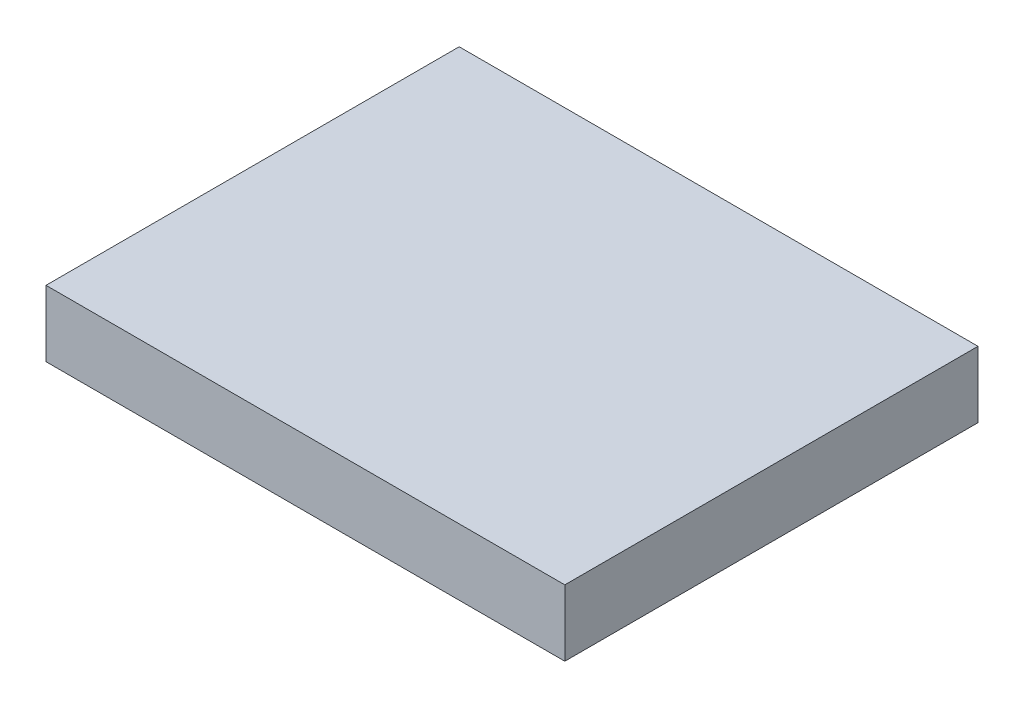
ISO-10303-21;
HEADER;
FILE_DESCRIPTION(('STEP AP214'),'2;1');
FILE_NAME('part.step','',(''),(''),'','','');
FILE_SCHEMA(('AUTOMOTIVE_DESIGN { 1 0 10303 214 1 1 1 1 }'));
ENDSEC;
DATA;
#1=APPLICATION_CONTEXT('core data for automotive mechanical design processes');
#2=APPLICATION_PROTOCOL_DEFINITION('international standard','automotive_design',2000,#1);
#3=PRODUCT_CONTEXT('',#1,'mechanical');
#4=PRODUCT('Part','Part','',(#3));
#5=PRODUCT_RELATED_PRODUCT_CATEGORY('part','',(#4));
#6=PRODUCT_DEFINITION_FORMATION('','',#4);
#7=PRODUCT_DEFINITION_CONTEXT('part definition',#1,'design');
#8=PRODUCT_DEFINITION('design','',#6,#7);
#9=PRODUCT_DEFINITION_SHAPE('','',#8);
#10=(LENGTH_UNIT() NAMED_UNIT(*) SI_UNIT(.MILLI.,.METRE.));
#11=(NAMED_UNIT(*) PLANE_ANGLE_UNIT() SI_UNIT($,.RADIAN.));
#12=(NAMED_UNIT(*) SI_UNIT($,.STERADIAN.) SOLID_ANGLE_UNIT());
#13=UNCERTAINTY_MEASURE_WITH_UNIT(LENGTH_MEASURE(1.E-05),#10,'distance_accuracy_value','');
#14=(GEOMETRIC_REPRESENTATION_CONTEXT(3) GLOBAL_UNCERTAINTY_ASSIGNED_CONTEXT((#13)) GLOBAL_UNIT_ASSIGNED_CONTEXT((#10,
#11,#12)) REPRESENTATION_CONTEXT('',''));
#15=CARTESIAN_POINT('',(0.,0.,0.));
#16=DIRECTION('',(0.,0.,1.));
#17=DIRECTION('',(1.,0.,0.));
#18=AXIS2_PLACEMENT_3D('',#15,#16,#17);
#19=CARTESIAN_POINT('',(0.,54.102,0.));
#20=DIRECTION('',(1.,0.,0.));
#21=DIRECTION('',(0.,0.,-1.));
#22=AXIS2_PLACEMENT_3D('',#19,#20,#21);
#23=PLANE('',#22);
#24=DIRECTION('',(0.,0.,1.));
#25=VECTOR('',#24,1.);
#26=CARTESIAN_POINT('',(0.,0.,0.));
#27=LINE('',#26,#25);
#28=CARTESIAN_POINT('',(0.,0.,-337.82));
#29=VERTEX_POINT('',#28);
#30=CARTESIAN_POINT('',(0.,0.,0.));
#31=VERTEX_POINT('',#30);
#32=EDGE_CURVE('E115',#29,#31,#27,.T.);
#33=ORIENTED_EDGE('',*,*,#32,.T.);
#34=DIRECTION('',(0.,-1.,0.));
#35=VECTOR('',#34,1.);
#36=CARTESIAN_POINT('',(0.,54.102,0.));
#37=LINE('',#36,#35);
#38=CARTESIAN_POINT('',(0.,54.102,0.));
#39=VERTEX_POINT('',#38);
#40=EDGE_CURVE('E11',#39,#31,#37,.T.);
#41=ORIENTED_EDGE('',*,*,#40,.F.);
#42=DIRECTION('',(0.,0.,1.));
#43=VECTOR('',#42,1.);
#44=CARTESIAN_POINT('',(0.,54.102,0.));
#45=LINE('',#44,#43);
#46=CARTESIAN_POINT('',(0.,54.102,-337.82));
#47=VERTEX_POINT('',#46);
#48=EDGE_CURVE('E98',#47,#39,#45,.T.);
#49=ORIENTED_EDGE('',*,*,#48,.F.);
#50=DIRECTION('',(0.,-1.,0.));
#51=VECTOR('',#50,1.);
#52=CARTESIAN_POINT('',(0.,54.102,-337.82));
#53=LINE('',#52,#51);
#54=EDGE_CURVE('E111',#47,#29,#53,.T.);
#55=ORIENTED_EDGE('',*,*,#54,.T.);
#56=EDGE_LOOP('',(#33,#41,#49,#55));
#57=FACE_BOUND('',#56,.T.);
#58=ADVANCED_FACE('F38',(#57),#23,.F.);
#59=CARTESIAN_POINT('',(0.,54.102,0.));
#60=DIRECTION('',(0.,0.,-1.));
#61=DIRECTION('',(-1.,0.,0.));
#62=AXIS2_PLACEMENT_3D('',#59,#60,#61);
#63=PLANE('',#62);
#64=DIRECTION('',(1.,0.,0.));
#65=VECTOR('',#64,1.);
#66=CARTESIAN_POINT('',(0.,0.,0.));
#67=LINE('',#66,#65);
#68=CARTESIAN_POINT('',(424.18,0.,0.));
#69=VERTEX_POINT('',#68);
#70=EDGE_CURVE('E103',#31,#69,#67,.T.);
#71=ORIENTED_EDGE('',*,*,#70,.T.);
#72=DIRECTION('',(0.,-1.,0.));
#73=VECTOR('',#72,1.);
#74=CARTESIAN_POINT('',(424.18,54.102,0.));
#75=LINE('',#74,#73);
#76=CARTESIAN_POINT('',(424.18,54.102,0.));
#77=VERTEX_POINT('',#76);
#78=EDGE_CURVE('E47',#77,#69,#75,.T.);
#79=ORIENTED_EDGE('',*,*,#78,.F.);
#80=DIRECTION('',(1.,0.,0.));
#81=VECTOR('',#80,1.);
#82=CARTESIAN_POINT('',(0.,54.102,0.));
#83=LINE('',#82,#81);
#84=EDGE_CURVE('E93',#39,#77,#83,.T.);
#85=ORIENTED_EDGE('',*,*,#84,.F.);
#86=ORIENTED_EDGE('',*,*,#40,.T.);
#87=EDGE_LOOP('',(#71,#79,#85,#86));
#88=FACE_BOUND('',#87,.T.);
#89=ADVANCED_FACE('F102',(#88),#63,.F.);
#90=CARTESIAN_POINT('',(424.18,54.102,0.));
#91=DIRECTION('',(-1.,0.,0.));
#92=DIRECTION('',(0.,0.,1.));
#93=AXIS2_PLACEMENT_3D('',#90,#91,#92);
#94=PLANE('',#93);
#95=DIRECTION('',(0.,0.,-1.));
#96=VECTOR('',#95,1.);
#97=CARTESIAN_POINT('',(424.18,0.,0.));
#98=LINE('',#97,#96);
#99=CARTESIAN_POINT('',(424.18,0.,-337.82));
#100=VERTEX_POINT('',#99);
#101=EDGE_CURVE('E78',#69,#100,#98,.T.);
#102=ORIENTED_EDGE('',*,*,#101,.T.);
#103=DIRECTION('',(0.,-1.,0.));
#104=VECTOR('',#103,1.);
#105=CARTESIAN_POINT('',(424.18,54.102,-337.82));
#106=LINE('',#105,#104);
#107=CARTESIAN_POINT('',(424.18,54.102,-337.82));
#108=VERTEX_POINT('',#107);
#109=EDGE_CURVE('E105',#108,#100,#106,.T.);
#110=ORIENTED_EDGE('',*,*,#109,.F.);
#111=DIRECTION('',(0.,0.,-1.));
#112=VECTOR('',#111,1.);
#113=CARTESIAN_POINT('',(424.18,54.102,0.));
#114=LINE('',#113,#112);
#115=EDGE_CURVE('E96',#77,#108,#114,.T.);
#116=ORIENTED_EDGE('',*,*,#115,.F.);
#117=ORIENTED_EDGE('',*,*,#78,.T.);
#118=EDGE_LOOP('',(#102,#110,#116,#117));
#119=FACE_BOUND('',#118,.T.);
#120=ADVANCED_FACE('F106',(#119),#94,.F.);
#121=CARTESIAN_POINT('',(0.,54.102,-337.82));
#122=DIRECTION('',(0.,0.,1.));
#123=DIRECTION('',(1.,0.,0.));
#124=AXIS2_PLACEMENT_3D('',#121,#122,#123);
#125=PLANE('',#124);
#126=DIRECTION('',(-1.,0.,0.));
#127=VECTOR('',#126,1.);
#128=CARTESIAN_POINT('',(0.,0.,-337.82));
#129=LINE('',#128,#127);
#130=EDGE_CURVE('E84',#100,#29,#129,.T.);
#131=ORIENTED_EDGE('',*,*,#130,.T.);
#132=ORIENTED_EDGE('',*,*,#54,.F.);
#133=DIRECTION('',(-1.,0.,0.));
#134=VECTOR('',#133,1.);
#135=CARTESIAN_POINT('',(0.,54.102,-337.82));
#136=LINE('',#135,#134);
#137=EDGE_CURVE('E58',#108,#47,#136,.T.);
#138=ORIENTED_EDGE('',*,*,#137,.F.);
#139=ORIENTED_EDGE('',*,*,#109,.T.);
#140=EDGE_LOOP('',(#131,#132,#138,#139));
#141=FACE_BOUND('',#140,.T.);
#142=ADVANCED_FACE('F127',(#141),#125,.F.);
#143=CARTESIAN_POINT('',(0.,54.102,0.));
#144=DIRECTION('',(0.,-1.,0.));
#145=DIRECTION('',(0.,0.,-1.));
#146=AXIS2_PLACEMENT_3D('',#143,#144,#145);
#147=PLANE('',#146);
#148=ORIENTED_EDGE('',*,*,#48,.T.);
#149=ORIENTED_EDGE('',*,*,#84,.T.);
#150=ORIENTED_EDGE('',*,*,#115,.T.);
#151=ORIENTED_EDGE('',*,*,#137,.T.);
#152=EDGE_LOOP('',(#148,#149,#150,#151));
#153=FACE_BOUND('',#152,.T.);
#154=ADVANCED_FACE('F94',(#153),#147,.F.);
#155=CARTESIAN_POINT('',(0.,0.,0.));
#156=DIRECTION('',(0.,-1.,0.));
#157=DIRECTION('',(0.,0.,-1.));
#158=AXIS2_PLACEMENT_3D('',#155,#156,#157);
#159=PLANE('',#158);
#160=ORIENTED_EDGE('',*,*,#32,.F.);
#161=ORIENTED_EDGE('',*,*,#130,.F.);
#162=ORIENTED_EDGE('',*,*,#101,.F.);
#163=ORIENTED_EDGE('',*,*,#70,.F.);
#164=EDGE_LOOP('',(#160,#161,#162,#163));
#165=FACE_BOUND('',#164,.T.);
#166=ADVANCED_FACE('F130',(#165),#159,.T.);
#167=CLOSED_SHELL('',(#58,#89,#120,#142,#154,#166));
#168=MANIFOLD_SOLID_BREP('B2',#167);
#169=ADVANCED_BREP_SHAPE_REPRESENTATION('',(#18,#168),#14);
#170=SHAPE_DEFINITION_REPRESENTATION(#9,#169);
ENDSEC;
END-ISO-10303-21;
